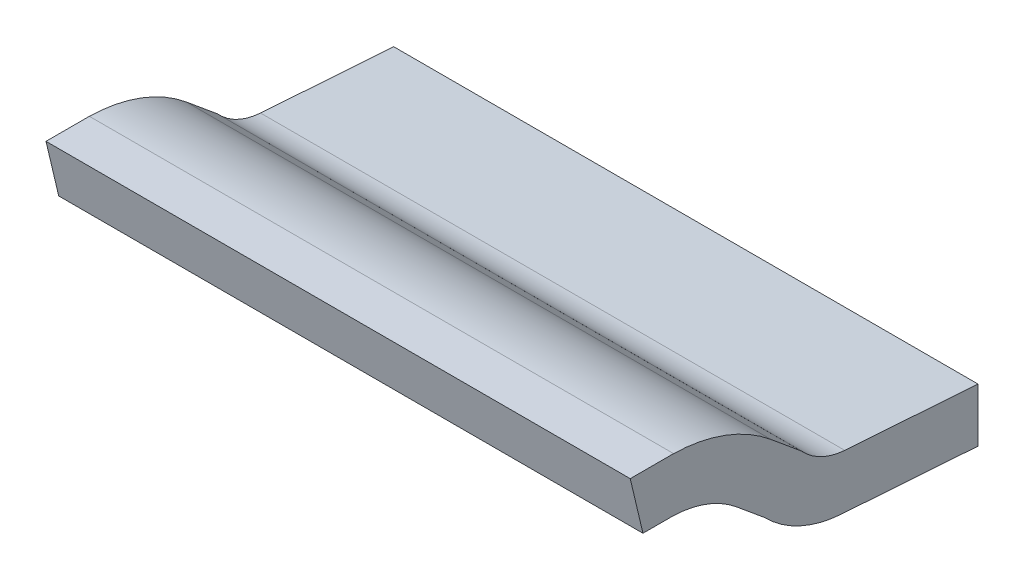
ISO-10303-21;
HEADER;
FILE_DESCRIPTION(('STEP AP214'),'2;1');
FILE_NAME('part.step','',(''),(''),'','','');
FILE_SCHEMA(('AUTOMOTIVE_DESIGN { 1 0 10303 214 1 1 1 1 }'));
ENDSEC;
DATA;
#1=APPLICATION_CONTEXT('core data for automotive mechanical design processes');
#2=APPLICATION_PROTOCOL_DEFINITION('international standard','automotive_design',2000,#1);
#3=PRODUCT_CONTEXT('',#1,'mechanical');
#4=PRODUCT('Part','Part','',(#3));
#5=PRODUCT_RELATED_PRODUCT_CATEGORY('part','',(#4));
#6=PRODUCT_DEFINITION_FORMATION('','',#4);
#7=PRODUCT_DEFINITION_CONTEXT('part definition',#1,'design');
#8=PRODUCT_DEFINITION('design','',#6,#7);
#9=PRODUCT_DEFINITION_SHAPE('','',#8);
#10=(LENGTH_UNIT() NAMED_UNIT(*) SI_UNIT(.MILLI.,.METRE.));
#11=(NAMED_UNIT(*) PLANE_ANGLE_UNIT() SI_UNIT($,.RADIAN.));
#12=(NAMED_UNIT(*) SI_UNIT($,.STERADIAN.) SOLID_ANGLE_UNIT());
#13=UNCERTAINTY_MEASURE_WITH_UNIT(LENGTH_MEASURE(1.E-05),#10,'distance_accuracy_value','');
#14=(GEOMETRIC_REPRESENTATION_CONTEXT(3) GLOBAL_UNCERTAINTY_ASSIGNED_CONTEXT((#13)) GLOBAL_UNIT_ASSIGNED_CONTEXT((#10,
#11,#12)) REPRESENTATION_CONTEXT('',''));
#15=CARTESIAN_POINT('',(0.,0.,0.));
#16=DIRECTION('',(0.,0.,1.));
#17=DIRECTION('',(1.,0.,0.));
#18=AXIS2_PLACEMENT_3D('',#15,#16,#17);
#19=CARTESIAN_POINT('',(0.,-0.07949339768017,-1.601675660036));
#20=DIRECTION('',(0.,1.,0.));
#21=DIRECTION('',(1.,0.,0.));
#22=AXIS2_PLACEMENT_3D('',#19,#20,#21);
#23=PLANE('',#22);
#24=DIRECTION('',(1.,0.,0.));
#25=VECTOR('',#24,1.);
#26=CARTESIAN_POINT('',(0.,-0.07949339768017,-1.906104664712));
#27=LINE('',#26,#25);
#28=CARTESIAN_POINT('',(-1.52,-0.07949339768017,-1.906104664712));
#29=VERTEX_POINT('',#28);
#30=CARTESIAN_POINT('',(1.52,-0.07949339768017,-1.906104664712));
#31=VERTEX_POINT('',#30);
#32=EDGE_CURVE('E26',#29,#31,#27,.T.);
#33=ORIENTED_EDGE('',*,*,#32,.F.);
#34=DIRECTION('',(0.,0.,1.));
#35=VECTOR('',#34,1.);
#36=CARTESIAN_POINT('',(-1.52,-0.07949339768017,-1.601675660036));
#37=LINE('',#36,#35);
#38=CARTESIAN_POINT('',(-1.52,-0.07949339768016,-1.680533679812));
#39=VERTEX_POINT('',#38);
#40=EDGE_CURVE('E206',#29,#39,#37,.T.);
#41=ORIENTED_EDGE('',*,*,#40,.T.);
#42=DIRECTION('',(-1.,0.,0.));
#43=VECTOR('',#42,1.);
#44=CARTESIAN_POINT('',(0.,-0.07949339768016,-1.680533679812));
#45=LINE('',#44,#43);
#46=CARTESIAN_POINT('',(1.52,-0.07949339768017,-1.680533679812));
#47=VERTEX_POINT('',#46);
#48=EDGE_CURVE('E11',#47,#39,#45,.T.);
#49=ORIENTED_EDGE('',*,*,#48,.F.);
#50=DIRECTION('',(0.,0.,-1.));
#51=VECTOR('',#50,1.);
#52=CARTESIAN_POINT('',(1.52,-0.07949339768017,-1.601675660036));
#53=LINE('',#52,#51);
#54=EDGE_CURVE('E178',#47,#31,#53,.T.);
#55=ORIENTED_EDGE('',*,*,#54,.T.);
#56=EDGE_LOOP('',(#33,#41,#49,#55));
#57=FACE_BOUND('',#56,.T.);
#58=ADVANCED_FACE('F17',(#57),#23,.T.);
#59=CARTESIAN_POINT('',(0.,-0.632619675337,-1.811537271888));
#60=DIRECTION('',(0.,-0.230466383879013,0.973080287490057));
#61=DIRECTION('',(-1.,0.,0.));
#62=AXIS2_PLACEMENT_3D('',#59,#60,#61);
#63=PLANE('',#62);
#64=DIRECTION('',(-1.,0.,0.));
#65=VECTOR('',#64,1.);
#66=CARTESIAN_POINT('',(0.,-0.358826368266,-1.746691488635));
#67=LINE('',#66,#65);
#68=CARTESIAN_POINT('',(1.52,-0.358826368266,-1.746691488635));
#69=VERTEX_POINT('',#68);
#70=CARTESIAN_POINT('',(-1.52,-0.358826368266,-1.746691488635));
#71=VERTEX_POINT('',#70);
#72=EDGE_CURVE('E246',#69,#71,#67,.T.);
#73=ORIENTED_EDGE('',*,*,#72,.F.);
#74=DIRECTION('',(0.,0.973080287490057,0.230466383879013));
#75=VECTOR('',#74,1.);
#76=CARTESIAN_POINT('',(1.52,-0.632619675337,-1.811537271888));
#77=LINE('',#76,#75);
#78=EDGE_CURVE('E181',#69,#47,#77,.T.);
#79=ORIENTED_EDGE('',*,*,#78,.T.);
#80=ORIENTED_EDGE('',*,*,#48,.T.);
#81=DIRECTION('',(0.,-0.973080287490057,-0.230466383879013));
#82=VECTOR('',#81,1.);
#83=CARTESIAN_POINT('',(-1.52,-0.632619675337,-1.811537271888));
#84=LINE('',#83,#82);
#85=EDGE_CURVE('E202',#39,#71,#84,.T.);
#86=ORIENTED_EDGE('',*,*,#85,.T.);
#87=EDGE_LOOP('',(#73,#79,#80,#86));
#88=FACE_BOUND('',#87,.T.);
#89=ADVANCED_FACE('F19',(#88),#63,.T.);
#90=CARTESIAN_POINT('',(0.,-0.902094351244,-1.887125979746));
#91=DIRECTION('',(1.,0.,0.));
#92=DIRECTION('',(0.,1.,0.));
#93=AXIS2_PLACEMENT_3D('',#90,#91,#92);
#94=CYLINDRICAL_SURFACE('',#93,0.822819858345);
#95=DIRECTION('',(1.,0.,0.));
#96=VECTOR('',#95,1.);
#97=CARTESIAN_POINT('',(0.,-0.268722215313,-2.412361409543));
#98=LINE('',#97,#96);
#99=CARTESIAN_POINT('',(-1.52,-0.268722215313,-2.412361409543));
#100=VERTEX_POINT('',#99);
#101=CARTESIAN_POINT('',(1.52,-0.268722215313,-2.412361409543));
#102=VERTEX_POINT('',#101);
#103=EDGE_CURVE('E243',#100,#102,#98,.T.);
#104=ORIENTED_EDGE('',*,*,#103,.F.);
#105=CARTESIAN_POINT('',(-1.52,-0.902094351244,-1.887125979746));
#106=DIRECTION('',(1.,0.,0.));
#107=DIRECTION('',(0.,1.,0.));
#108=AXIS2_PLACEMENT_3D('',#105,#106,#107);
#109=CIRCLE('',#108,0.822819858345);
#110=EDGE_CURVE('E190',#100,#29,#109,.T.);
#111=ORIENTED_EDGE('',*,*,#110,.T.);
#112=ORIENTED_EDGE('',*,*,#32,.T.);
#113=CARTESIAN_POINT('',(1.52,-0.902094351244,-1.887125979746));
#114=DIRECTION('',(-1.,0.,0.));
#115=DIRECTION('',(0.,1.,0.));
#116=AXIS2_PLACEMENT_3D('',#113,#114,#115);
#117=CIRCLE('',#116,0.822819858345);
#118=EDGE_CURVE('E182',#31,#102,#117,.T.);
#119=ORIENTED_EDGE('',*,*,#118,.T.);
#120=EDGE_LOOP('',(#104,#111,#112,#119));
#121=FACE_BOUND('',#120,.T.);
#122=ADVANCED_FACE('F273',(#121),#94,.T.);
#123=CARTESIAN_POINT('',(0.,-0.358826368266,-1.620991237789));
#124=DIRECTION('',(0.,-1.,0.));
#125=DIRECTION('',(0.,0.,-1.));
#126=AXIS2_PLACEMENT_3D('',#123,#124,#125);
#127=PLANE('',#126);
#128=DIRECTION('',(1.,0.,0.));
#129=VECTOR('',#128,1.);
#130=CARTESIAN_POINT('',(0.,-0.358826368266,-1.902583918342));
#131=LINE('',#130,#129);
#132=CARTESIAN_POINT('',(-1.52,-0.358826368266,-1.902583918342));
#133=VERTEX_POINT('',#132);
#134=CARTESIAN_POINT('',(1.52,-0.358826368266,-1.902583918342));
#135=VERTEX_POINT('',#134);
#136=EDGE_CURVE('E223',#133,#135,#131,.T.);
#137=ORIENTED_EDGE('',*,*,#136,.T.);
#138=DIRECTION('',(0.,0.,1.));
#139=VECTOR('',#138,1.);
#140=CARTESIAN_POINT('',(1.52,-0.358826368266,-1.620991237789));
#141=LINE('',#140,#139);
#142=EDGE_CURVE('E236',#135,#69,#141,.T.);
#143=ORIENTED_EDGE('',*,*,#142,.T.);
#144=ORIENTED_EDGE('',*,*,#72,.T.);
#145=DIRECTION('',(0.,0.,-1.));
#146=VECTOR('',#145,1.);
#147=CARTESIAN_POINT('',(-1.52,-0.358826368266,-1.620991237789));
#148=LINE('',#147,#146);
#149=EDGE_CURVE('E195',#71,#133,#148,.T.);
#150=ORIENTED_EDGE('',*,*,#149,.T.);
#151=EDGE_LOOP('',(#137,#143,#144,#150));
#152=FACE_BOUND('',#151,.T.);
#153=ADVANCED_FACE('F292',(#152),#127,.T.);
#154=CARTESIAN_POINT('',(0.,-0.268722215313,-2.412361409543));
#155=DIRECTION('',(0.,0.769757960393001,-0.638335869595001));
#156=DIRECTION('',(-1.,0.,0.));
#157=AXIS2_PLACEMENT_3D('',#154,#155,#156);
#158=PLANE('',#157);
#159=ORIENTED_EDGE('',*,*,#103,.T.);
#160=DIRECTION('',(0.,-0.638335869595001,-0.769757960393001));
#161=VECTOR('',#160,1.);
#162=CARTESIAN_POINT('',(1.52,-0.268722215313,-2.412361409543));
#163=LINE('',#162,#161);
#164=CARTESIAN_POINT('',(1.52,-0.401104982558,-2.571999452397));
#165=VERTEX_POINT('',#164);
#166=EDGE_CURVE('E259',#102,#165,#163,.T.);
#167=ORIENTED_EDGE('',*,*,#166,.T.);
#168=DIRECTION('',(-1.,0.,0.));
#169=VECTOR('',#168,1.);
#170=CARTESIAN_POINT('',(0.,-0.401104982558,-2.571999452397));
#171=LINE('',#170,#169);
#172=CARTESIAN_POINT('',(-1.52,-0.401104982558,-2.571999452397));
#173=VERTEX_POINT('',#172);
#174=EDGE_CURVE('E38',#165,#173,#171,.T.);
#175=ORIENTED_EDGE('',*,*,#174,.T.);
#176=DIRECTION('',(0.,0.638335869595001,0.769757960393001));
#177=VECTOR('',#176,1.);
#178=CARTESIAN_POINT('',(-1.52,-0.268722215313,-2.412361409543));
#179=LINE('',#178,#177);
#180=EDGE_CURVE('E186',#173,#100,#179,.T.);
#181=ORIENTED_EDGE('',*,*,#180,.T.);
#182=EDGE_LOOP('',(#159,#167,#175,#181));
#183=FACE_BOUND('',#182,.T.);
#184=ADVANCED_FACE('F282',(#183),#158,.T.);
#185=CARTESIAN_POINT('',(0.,-0.902094351244,-1.887125979746));
#186=DIRECTION('',(1.,0.,0.));
#187=DIRECTION('',(0.,1.,0.));
#188=AXIS2_PLACEMENT_3D('',#185,#186,#187);
#189=CYLINDRICAL_SURFACE('',#188,0.543487855609);
#190=ORIENTED_EDGE('',*,*,#136,.F.);
#191=CARTESIAN_POINT('',(-1.52,-0.902094351244,-1.887125979746));
#192=DIRECTION('',(1.,0.,0.));
#193=DIRECTION('',(0.,1.,0.));
#194=AXIS2_PLACEMENT_3D('',#191,#192,#193);
#195=CIRCLE('',#194,0.543487855609);
#196=CARTESIAN_POINT('',(-1.52,-0.483740248011,-2.234053772671));
#197=VERTEX_POINT('',#196);
#198=EDGE_CURVE('E162',#197,#133,#195,.T.);
#199=ORIENTED_EDGE('',*,*,#198,.F.);
#200=DIRECTION('',(-1.,0.,0.));
#201=VECTOR('',#200,1.);
#202=CARTESIAN_POINT('',(0.,-0.483740248011,-2.234053772671));
#203=LINE('',#202,#201);
#204=CARTESIAN_POINT('',(1.52,-0.483740248011,-2.234053772671));
#205=VERTEX_POINT('',#204);
#206=EDGE_CURVE('E212',#205,#197,#203,.T.);
#207=ORIENTED_EDGE('',*,*,#206,.F.);
#208=CARTESIAN_POINT('',(1.52,-0.902094351244,-1.887125979746));
#209=DIRECTION('',(-1.,0.,0.));
#210=DIRECTION('',(0.,1.,0.));
#211=AXIS2_PLACEMENT_3D('',#208,#209,#210);
#212=CIRCLE('',#211,0.543487855609);
#213=EDGE_CURVE('E240',#135,#205,#212,.T.);
#214=ORIENTED_EDGE('',*,*,#213,.F.);
#215=EDGE_LOOP('',(#190,#199,#207,#214));
#216=FACE_BOUND('',#215,.T.);
#217=ADVANCED_FACE('F295',(#216),#189,.F.);
#218=CARTESIAN_POINT('',(0.,-0.176429564257,-2.819640338042));
#219=DIRECTION('',(-1.,0.,0.));
#220=DIRECTION('',(0.,-1.,0.));
#221=AXIS2_PLACEMENT_3D('',#218,#219,#220);
#222=CYLINDRICAL_SURFACE('',#221,0.334372624226);
#223=ORIENTED_EDGE('',*,*,#174,.F.);
#224=CARTESIAN_POINT('',(1.52,-0.176429564257,-2.819640338042));
#225=DIRECTION('',(-1.,0.,0.));
#226=DIRECTION('',(0.,-1.,0.));
#227=AXIS2_PLACEMENT_3D('',#224,#225,#226);
#228=CIRCLE('',#227,0.334372624226);
#229=CARTESIAN_POINT('',(1.52,-0.510005629998,-2.796573907965));
#230=VERTEX_POINT('',#229);
#231=EDGE_CURVE('E255',#230,#165,#228,.T.);
#232=ORIENTED_EDGE('',*,*,#231,.F.);
#233=DIRECTION('',(1.,0.,0.));
#234=VECTOR('',#233,1.);
#235=CARTESIAN_POINT('',(0.,-0.510005629998,-2.796573907965));
#236=LINE('',#235,#234);
#237=CARTESIAN_POINT('',(-1.52,-0.510005629998,-2.796573907965));
#238=VERTEX_POINT('',#237);
#239=EDGE_CURVE('E48',#238,#230,#236,.T.);
#240=ORIENTED_EDGE('',*,*,#239,.F.);
#241=CARTESIAN_POINT('',(-1.52,-0.176429564257,-2.819640338042));
#242=DIRECTION('',(1.,0.,0.));
#243=DIRECTION('',(0.,-1.,0.));
#244=AXIS2_PLACEMENT_3D('',#241,#242,#243);
#245=CIRCLE('',#244,0.334372624226);
#246=EDGE_CURVE('E189',#173,#238,#245,.T.);
#247=ORIENTED_EDGE('',*,*,#246,.F.);
#248=EDGE_LOOP('',(#223,#232,#240,#247));
#249=FACE_BOUND('',#248,.T.);
#250=ADVANCED_FACE('F306',(#249),#222,.F.);
#251=CARTESIAN_POINT('',(0.,-0.483740248011,-2.234053772671));
#252=DIRECTION('',(0.,-0.769757960393001,0.638335869595001));
#253=DIRECTION('',(-1.,0.,0.));
#254=AXIS2_PLACEMENT_3D('',#251,#252,#253);
#255=PLANE('',#254);
#256=ORIENTED_EDGE('',*,*,#206,.T.);
#257=DIRECTION('',(0.,-0.638335869595001,-0.769757960393001));
#258=VECTOR('',#257,1.);
#259=CARTESIAN_POINT('',(-1.52,-0.483740248011,-2.234053772671));
#260=LINE('',#259,#258);
#261=CARTESIAN_POINT('',(-1.52,-0.605666601069,-2.381082610181));
#262=VERTEX_POINT('',#261);
#263=EDGE_CURVE('E152',#197,#262,#260,.T.);
#264=ORIENTED_EDGE('',*,*,#263,.T.);
#265=DIRECTION('',(-1.,0.,0.));
#266=VECTOR('',#265,1.);
#267=CARTESIAN_POINT('',(0.,-0.605666601069,-2.381082610181));
#268=LINE('',#267,#266);
#269=CARTESIAN_POINT('',(1.52,-0.605666601069,-2.381082610181));
#270=VERTEX_POINT('',#269);
#271=EDGE_CURVE('E151',#270,#262,#268,.T.);
#272=ORIENTED_EDGE('',*,*,#271,.F.);
#273=DIRECTION('',(0.,0.638335869595001,0.769757960393001));
#274=VECTOR('',#273,1.);
#275=CARTESIAN_POINT('',(1.52,-0.483740248011,-2.234053772671));
#276=LINE('',#275,#274);
#277=EDGE_CURVE('E146',#270,#205,#276,.T.);
#278=ORIENTED_EDGE('',*,*,#277,.T.);
#279=EDGE_LOOP('',(#256,#264,#272,#278));
#280=FACE_BOUND('',#279,.T.);
#281=ADVANCED_FACE('F299',(#280),#255,.T.);
#282=CARTESIAN_POINT('',(0.,-0.510005629998,-2.796573907965));
#283=DIRECTION('',(0.,0.99761775209068,-0.0689842062615679));
#284=DIRECTION('',(-1.,0.,0.));
#285=AXIS2_PLACEMENT_3D('',#282,#283,#284);
#286=PLANE('',#285);
#287=ORIENTED_EDGE('',*,*,#239,.T.);
#288=DIRECTION('',(0.,-0.0689842062615679,-0.99761775209068));
#289=VECTOR('',#288,1.);
#290=CARTESIAN_POINT('',(1.52,-0.510005629998,-2.796573907965));
#291=LINE('',#290,#289);
#292=CARTESIAN_POINT('',(1.52,-0.557957750882,-3.490035348437));
#293=VERTEX_POINT('',#292);
#294=EDGE_CURVE('E252',#230,#293,#291,.T.);
#295=ORIENTED_EDGE('',*,*,#294,.T.);
#296=DIRECTION('',(-1.,0.,0.));
#297=VECTOR('',#296,1.);
#298=CARTESIAN_POINT('',(0.,-0.557957750882,-3.490035348437));
#299=LINE('',#298,#297);
#300=CARTESIAN_POINT('',(-1.52,-0.557957750882,-3.490035348437));
#301=VERTEX_POINT('',#300);
#302=EDGE_CURVE('E213',#293,#301,#299,.T.);
#303=ORIENTED_EDGE('',*,*,#302,.T.);
#304=DIRECTION('',(0.,0.0689842062615679,0.99761775209068));
#305=VECTOR('',#304,1.);
#306=CARTESIAN_POINT('',(-1.52,-0.510005629998,-2.796573907965));
#307=LINE('',#306,#305);
#308=EDGE_CURVE('E219',#301,#238,#307,.T.);
#309=ORIENTED_EDGE('',*,*,#308,.T.);
#310=EDGE_LOOP('',(#287,#295,#303,#309));
#311=FACE_BOUND('',#310,.T.);
#312=ADVANCED_FACE('F305',(#311),#286,.T.);
#313=CARTESIAN_POINT('',(0.,-0.697859069965,-3.490035348437));
#314=DIRECTION('',(0.,0.,1.));
#315=DIRECTION('',(0.,-1.,0.));
#316=AXIS2_PLACEMENT_3D('',#313,#314,#315);
#317=PLANE('',#316);
#318=DIRECTION('',(0.,1.,0.));
#319=VECTOR('',#318,1.);
#320=CARTESIAN_POINT('',(1.52,-0.219159882973,-3.490035348437));
#321=LINE('',#320,#319);
#322=CARTESIAN_POINT('',(1.52,-0.83791100083,-3.490035348437));
#323=VERTEX_POINT('',#322);
#324=EDGE_CURVE('E249',#323,#293,#321,.T.);
#325=ORIENTED_EDGE('',*,*,#324,.F.);
#326=DIRECTION('',(1.,0.,0.));
#327=VECTOR('',#326,1.);
#328=CARTESIAN_POINT('',(0.,-0.83791100083,-3.490035348437));
#329=LINE('',#328,#327);
#330=CARTESIAN_POINT('',(-1.52,-0.83791100083,-3.490035348437));
#331=VERTEX_POINT('',#330);
#332=EDGE_CURVE('E160',#331,#323,#329,.T.);
#333=ORIENTED_EDGE('',*,*,#332,.F.);
#334=DIRECTION('',(0.,-1.,0.));
#335=VECTOR('',#334,1.);
#336=CARTESIAN_POINT('',(-1.52,-0.219159882973,-3.490035348437));
#337=LINE('',#336,#335);
#338=EDGE_CURVE('E198',#301,#331,#337,.T.);
#339=ORIENTED_EDGE('',*,*,#338,.F.);
#340=ORIENTED_EDGE('',*,*,#302,.F.);
#341=EDGE_LOOP('',(#325,#333,#339,#340));
#342=FACE_BOUND('',#341,.T.);
#343=ADVANCED_FACE('F304',(#342),#317,.F.);
#344=CARTESIAN_POINT('',(1.52,-0.219159882973,-1.611333448912));
#345=DIRECTION('',(1.,0.,0.));
#346=DIRECTION('',(0.,1.,0.));
#347=AXIS2_PLACEMENT_3D('',#344,#345,#346);
#348=PLANE('',#347);
#349=ORIENTED_EDGE('',*,*,#118,.F.);
#350=ORIENTED_EDGE('',*,*,#54,.F.);
#351=ORIENTED_EDGE('',*,*,#78,.F.);
#352=ORIENTED_EDGE('',*,*,#142,.F.);
#353=ORIENTED_EDGE('',*,*,#213,.T.);
#354=ORIENTED_EDGE('',*,*,#277,.F.);
#355=CARTESIAN_POINT('',(1.52,-0.176429564257,-2.819640338042));
#356=DIRECTION('',(-1.,0.,0.));
#357=DIRECTION('',(0.,-1.,0.));
#358=AXIS2_PLACEMENT_3D('',#355,#356,#357);
#359=CIRCLE('',#358,0.613658956129);
#360=CARTESIAN_POINT('',(1.52,-0.788626632621,-2.777307562039));
#361=VERTEX_POINT('',#360);
#362=EDGE_CURVE('E137',#361,#270,#359,.T.);
#363=ORIENTED_EDGE('',*,*,#362,.F.);
#364=DIRECTION('',(0.,0.0689842062615679,0.99761775209068));
#365=VECTOR('',#364,1.);
#366=CARTESIAN_POINT('',(1.52,-0.788626632621,-2.777307562039));
#367=LINE('',#366,#365);
#368=EDGE_CURVE('E142',#323,#361,#367,.T.);
#369=ORIENTED_EDGE('',*,*,#368,.F.);
#370=ORIENTED_EDGE('',*,*,#324,.T.);
#371=ORIENTED_EDGE('',*,*,#294,.F.);
#372=ORIENTED_EDGE('',*,*,#231,.T.);
#373=ORIENTED_EDGE('',*,*,#166,.F.);
#374=EDGE_LOOP('',(#349,#350,#351,#352,#353,#354,#363,#369,#370,#371,#372,#373));
#375=FACE_BOUND('',#374,.T.);
#376=ADVANCED_FACE('F140',(#375),#348,.T.);
#377=CARTESIAN_POINT('',(0.,-0.176429564257,-2.819640338042));
#378=DIRECTION('',(-1.,0.,0.));
#379=DIRECTION('',(0.,-1.,0.));
#380=AXIS2_PLACEMENT_3D('',#377,#378,#379);
#381=CYLINDRICAL_SURFACE('',#380,0.613658956129);
#382=DIRECTION('',(-1.,0.,0.));
#383=VECTOR('',#382,1.);
#384=CARTESIAN_POINT('',(0.,-0.788626632621,-2.777307562039));
#385=LINE('',#384,#383);
#386=CARTESIAN_POINT('',(-1.52,-0.788626632621,-2.777307562039));
#387=VERTEX_POINT('',#386);
#388=EDGE_CURVE('E158',#361,#387,#385,.T.);
#389=ORIENTED_EDGE('',*,*,#388,.F.);
#390=ORIENTED_EDGE('',*,*,#362,.T.);
#391=ORIENTED_EDGE('',*,*,#271,.T.);
#392=CARTESIAN_POINT('',(-1.52,-0.176429564257,-2.819640338042));
#393=DIRECTION('',(-1.,0.,0.));
#394=DIRECTION('',(0.,-1.,0.));
#395=AXIS2_PLACEMENT_3D('',#392,#393,#394);
#396=CIRCLE('',#395,0.613658956129);
#397=EDGE_CURVE('E166',#387,#262,#396,.T.);
#398=ORIENTED_EDGE('',*,*,#397,.F.);
#399=EDGE_LOOP('',(#389,#390,#391,#398));
#400=FACE_BOUND('',#399,.T.);
#401=ADVANCED_FACE('F164',(#400),#381,.T.);
#402=CARTESIAN_POINT('',(-1.52,-0.219159882973,-1.611333448912));
#403=DIRECTION('',(-1.,0.,0.));
#404=DIRECTION('',(0.,1.,0.));
#405=AXIS2_PLACEMENT_3D('',#402,#403,#404);
#406=PLANE('',#405);
#407=ORIENTED_EDGE('',*,*,#198,.T.);
#408=ORIENTED_EDGE('',*,*,#149,.F.);
#409=ORIENTED_EDGE('',*,*,#85,.F.);
#410=ORIENTED_EDGE('',*,*,#40,.F.);
#411=ORIENTED_EDGE('',*,*,#110,.F.);
#412=ORIENTED_EDGE('',*,*,#180,.F.);
#413=ORIENTED_EDGE('',*,*,#246,.T.);
#414=ORIENTED_EDGE('',*,*,#308,.F.);
#415=ORIENTED_EDGE('',*,*,#338,.T.);
#416=DIRECTION('',(0.,-0.0689842062615679,-0.99761775209068));
#417=VECTOR('',#416,1.);
#418=CARTESIAN_POINT('',(-1.52,-0.788626632621,-2.777307562039));
#419=LINE('',#418,#417);
#420=EDGE_CURVE('E169',#387,#331,#419,.T.);
#421=ORIENTED_EDGE('',*,*,#420,.F.);
#422=ORIENTED_EDGE('',*,*,#397,.T.);
#423=ORIENTED_EDGE('',*,*,#263,.F.);
#424=EDGE_LOOP('',(#407,#408,#409,#410,#411,#412,#413,#414,#415,#421,#422,#423));
#425=FACE_BOUND('',#424,.T.);
#426=ADVANCED_FACE('F285',(#425),#406,.T.);
#427=CARTESIAN_POINT('',(0.,-0.788626632621,-2.777307562039));
#428=DIRECTION('',(0.,-0.99761775209068,0.0689842062615679));
#429=DIRECTION('',(-1.,0.,0.));
#430=AXIS2_PLACEMENT_3D('',#427,#428,#429);
#431=PLANE('',#430);
#432=ORIENTED_EDGE('',*,*,#388,.T.);
#433=ORIENTED_EDGE('',*,*,#420,.T.);
#434=ORIENTED_EDGE('',*,*,#332,.T.);
#435=ORIENTED_EDGE('',*,*,#368,.T.);
#436=EDGE_LOOP('',(#432,#433,#434,#435));
#437=FACE_BOUND('',#436,.T.);
#438=ADVANCED_FACE('F156',(#437),#431,.T.);
#439=CLOSED_SHELL('',(#58,#89,#122,#153,#184,#217,#250,#281,#312,#343,#376,#401,#426,#438));
#440=MANIFOLD_SOLID_BREP('B1',#439);
#441=ADVANCED_BREP_SHAPE_REPRESENTATION('',(#18,#440),#14);
#442=SHAPE_DEFINITION_REPRESENTATION(#9,#441);
ENDSEC;
END-ISO-10303-21;
